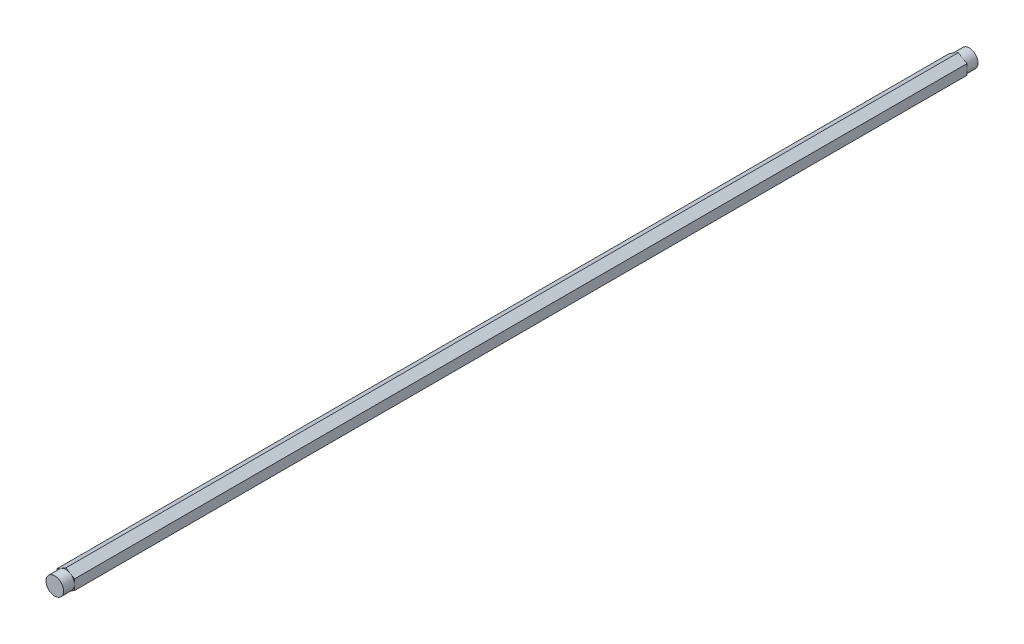
ISO-10303-21;
HEADER;
FILE_DESCRIPTION(('STEP AP214'),'2;1');
FILE_NAME('part.step','',(''),(''),'','','');
FILE_SCHEMA(('AUTOMOTIVE_DESIGN { 1 0 10303 214 1 1 1 1 }'));
ENDSEC;
DATA;
#1=APPLICATION_CONTEXT('core data for automotive mechanical design processes');
#2=APPLICATION_PROTOCOL_DEFINITION('international standard','automotive_design',2000,#1);
#3=PRODUCT_CONTEXT('',#1,'mechanical');
#4=PRODUCT('Part','Part','',(#3));
#5=PRODUCT_RELATED_PRODUCT_CATEGORY('part','',(#4));
#6=PRODUCT_DEFINITION_FORMATION('','',#4);
#7=PRODUCT_DEFINITION_CONTEXT('part definition',#1,'design');
#8=PRODUCT_DEFINITION('design','',#6,#7);
#9=PRODUCT_DEFINITION_SHAPE('','',#8);
#10=(LENGTH_UNIT() NAMED_UNIT(*) SI_UNIT(.MILLI.,.METRE.));
#11=(NAMED_UNIT(*) PLANE_ANGLE_UNIT() SI_UNIT($,.RADIAN.));
#12=(NAMED_UNIT(*) SI_UNIT($,.STERADIAN.) SOLID_ANGLE_UNIT());
#13=UNCERTAINTY_MEASURE_WITH_UNIT(LENGTH_MEASURE(1.E-05),#10,'distance_accuracy_value','');
#14=(GEOMETRIC_REPRESENTATION_CONTEXT(3) GLOBAL_UNCERTAINTY_ASSIGNED_CONTEXT((#13)) GLOBAL_UNIT_ASSIGNED_CONTEXT((#10,
#11,#12)) REPRESENTATION_CONTEXT('',''));
#15=CARTESIAN_POINT('',(0.,0.,0.));
#16=DIRECTION('',(0.,0.,1.));
#17=DIRECTION('',(1.,0.,0.));
#18=AXIS2_PLACEMENT_3D('',#15,#16,#17);
#19=CARTESIAN_POINT('',(6.34999999999996,3.6661742093542,330.2));
#20=DIRECTION('',(-0.499999999999995,-0.866025403784441,0.));
#21=DIRECTION('',(0.866025403784442,-0.499999999999995,0.));
#22=AXIS2_PLACEMENT_3D('',#19,#20,#21);
#23=PLANE('',#22);
#24=DIRECTION('',(0.,0.,-1.));
#25=VECTOR('',#24,1.);
#26=CARTESIAN_POINT('',(0.,7.33234841870825,330.2));
#27=LINE('',#26,#25);
#28=CARTESIAN_POINT('',(0.,7.33234841870825,322.2625));
#29=VERTEX_POINT('',#28);
#30=CARTESIAN_POINT('',(0.,7.33234841870825,-322.2625));
#31=VERTEX_POINT('',#30);
#32=EDGE_CURVE('E210',#29,#31,#27,.T.);
#33=ORIENTED_EDGE('',*,*,#32,.F.);
#34=DIRECTION('',(0.866025403784442,-0.499999999999995,0.));
#35=VECTOR('',#34,1.);
#36=CARTESIAN_POINT('',(6.34999999999996,3.6661742093542,322.2625));
#37=LINE('',#36,#35);
#38=CARTESIAN_POINT('',(3.17499999999997,5.4992613140312,322.2625));
#39=VERTEX_POINT('',#38);
#40=EDGE_CURVE('E263',#29,#39,#37,.T.);
#41=ORIENTED_EDGE('',*,*,#40,.T.);
#42=CARTESIAN_POINT('',(6.34999999999996,3.6661742093542,322.2625));
#43=VERTEX_POINT('',#42);
#44=EDGE_CURVE('E253',#39,#43,#37,.T.);
#45=ORIENTED_EDGE('',*,*,#44,.T.);
#46=DIRECTION('',(0.,0.,-1.));
#47=VECTOR('',#46,1.);
#48=CARTESIAN_POINT('',(6.34999999999996,3.6661742093542,330.2));
#49=LINE('',#48,#47);
#50=CARTESIAN_POINT('',(6.34999999999996,3.6661742093542,-322.2625));
#51=VERTEX_POINT('',#50);
#52=EDGE_CURVE('E201',#43,#51,#49,.T.);
#53=ORIENTED_EDGE('',*,*,#52,.T.);
#54=DIRECTION('',(0.866025403784442,-0.499999999999995,0.));
#55=VECTOR('',#54,1.);
#56=CARTESIAN_POINT('',(6.34999999999996,3.6661742093542,-322.2625));
#57=LINE('',#56,#55);
#58=CARTESIAN_POINT('',(3.17499999999997,5.4992613140312,-322.2625));
#59=VERTEX_POINT('',#58);
#60=EDGE_CURVE('E185',#59,#51,#57,.T.);
#61=ORIENTED_EDGE('',*,*,#60,.F.);
#62=EDGE_CURVE('E189',#31,#59,#57,.T.);
#63=ORIENTED_EDGE('',*,*,#62,.F.);
#64=EDGE_LOOP('',(#33,#41,#45,#53,#61,#63));
#65=FACE_BOUND('',#64,.T.);
#66=ADVANCED_FACE('F48',(#65),#23,.F.);
#67=CARTESIAN_POINT('',(0.,7.33234841870825,330.2));
#68=DIRECTION('',(0.500000000000001,-0.866025403784438,0.));
#69=DIRECTION('',(0.866025403784438,0.500000000000001,0.));
#70=AXIS2_PLACEMENT_3D('',#67,#68,#69);
#71=PLANE('',#70);
#72=DIRECTION('',(0.,0.,-1.));
#73=VECTOR('',#72,1.);
#74=CARTESIAN_POINT('',(-6.35000000000001,3.66617420935411,330.2));
#75=LINE('',#74,#73);
#76=CARTESIAN_POINT('',(-6.35000000000001,3.66617420935411,322.2625));
#77=VERTEX_POINT('',#76);
#78=CARTESIAN_POINT('',(-6.35000000000001,3.66617420935411,-322.2625));
#79=VERTEX_POINT('',#78);
#80=EDGE_CURVE('E208',#77,#79,#75,.T.);
#81=ORIENTED_EDGE('',*,*,#80,.F.);
#82=DIRECTION('',(0.866025403784438,0.500000000000001,0.));
#83=VECTOR('',#82,1.);
#84=CARTESIAN_POINT('',(0.,7.33234841870825,322.2625));
#85=LINE('',#84,#83);
#86=CARTESIAN_POINT('',(-3.17500000000001,5.49926131403118,322.2625));
#87=VERTEX_POINT('',#86);
#88=EDGE_CURVE('E145',#77,#87,#85,.T.);
#89=ORIENTED_EDGE('',*,*,#88,.T.);
#90=EDGE_CURVE('E178',#87,#29,#85,.T.);
#91=ORIENTED_EDGE('',*,*,#90,.T.);
#92=ORIENTED_EDGE('',*,*,#32,.T.);
#93=DIRECTION('',(0.866025403784438,0.500000000000001,0.));
#94=VECTOR('',#93,1.);
#95=CARTESIAN_POINT('',(0.,7.33234841870825,-322.2625));
#96=LINE('',#95,#94);
#97=CARTESIAN_POINT('',(-3.17500000000001,5.49926131403118,-322.2625));
#98=VERTEX_POINT('',#97);
#99=EDGE_CURVE('E192',#98,#31,#96,.T.);
#100=ORIENTED_EDGE('',*,*,#99,.F.);
#101=EDGE_CURVE('E196',#79,#98,#96,.T.);
#102=ORIENTED_EDGE('',*,*,#101,.F.);
#103=EDGE_LOOP('',(#81,#89,#91,#92,#100,#102));
#104=FACE_BOUND('',#103,.T.);
#105=ADVANCED_FACE('F269',(#104),#71,.F.);
#106=CARTESIAN_POINT('',(-6.35000000000001,3.66617420935411,330.2));
#107=DIRECTION('',(1.,0.,0.));
#108=DIRECTION('',(0.,1.,0.));
#109=AXIS2_PLACEMENT_3D('',#106,#107,#108);
#110=PLANE('',#109);
#111=DIRECTION('',(0.,0.,-1.));
#112=VECTOR('',#111,1.);
#113=CARTESIAN_POINT('',(-6.34999999999998,-3.66617420935415,330.2));
#114=LINE('',#113,#112);
#115=CARTESIAN_POINT('',(-6.34999999999998,-3.66617420935415,322.2625));
#116=VERTEX_POINT('',#115);
#117=CARTESIAN_POINT('',(-6.34999999999998,-3.66617420935415,-322.2625));
#118=VERTEX_POINT('',#117);
#119=EDGE_CURVE('E171',#116,#118,#114,.T.);
#120=ORIENTED_EDGE('',*,*,#119,.F.);
#121=DIRECTION('',(0.,1.,0.));
#122=VECTOR('',#121,1.);
#123=CARTESIAN_POINT('',(-6.35000000000001,3.66617420935411,322.2625));
#124=LINE('',#123,#122);
#125=CARTESIAN_POINT('',(-6.35,0.,322.2625));
#126=VERTEX_POINT('',#125);
#127=EDGE_CURVE('E149',#116,#126,#124,.T.);
#128=ORIENTED_EDGE('',*,*,#127,.T.);
#129=EDGE_CURVE('E139',#126,#77,#124,.T.);
#130=ORIENTED_EDGE('',*,*,#129,.T.);
#131=ORIENTED_EDGE('',*,*,#80,.T.);
#132=DIRECTION('',(0.,1.,0.));
#133=VECTOR('',#132,1.);
#134=CARTESIAN_POINT('',(-6.35000000000001,3.66617420935411,-322.2625));
#135=LINE('',#134,#133);
#136=CARTESIAN_POINT('',(-6.35,0.,-322.2625));
#137=VERTEX_POINT('',#136);
#138=EDGE_CURVE('E197',#137,#79,#135,.T.);
#139=ORIENTED_EDGE('',*,*,#138,.F.);
#140=EDGE_CURVE('E200',#118,#137,#135,.T.);
#141=ORIENTED_EDGE('',*,*,#140,.F.);
#142=EDGE_LOOP('',(#120,#128,#130,#131,#139,#141));
#143=FACE_BOUND('',#142,.T.);
#144=ADVANCED_FACE('F169',(#143),#110,.F.);
#145=CARTESIAN_POINT('',(-6.34999999999998,-3.66617420935415,330.2));
#146=DIRECTION('',(0.499999999999995,0.866025403784442,0.));
#147=DIRECTION('',(-0.866025403784442,0.499999999999995,0.));
#148=AXIS2_PLACEMENT_3D('',#145,#146,#147);
#149=PLANE('',#148);
#150=DIRECTION('',(0.,0.,-1.));
#151=VECTOR('',#150,1.);
#152=CARTESIAN_POINT('',(0.,-7.33234841870825,330.2));
#153=LINE('',#152,#151);
#154=CARTESIAN_POINT('',(0.,-7.33234841870825,322.2625));
#155=VERTEX_POINT('',#154);
#156=CARTESIAN_POINT('',(0.,-7.33234841870825,-322.2625));
#157=VERTEX_POINT('',#156);
#158=EDGE_CURVE('E205',#155,#157,#153,.T.);
#159=ORIENTED_EDGE('',*,*,#158,.F.);
#160=DIRECTION('',(-0.866025403784442,0.499999999999995,0.));
#161=VECTOR('',#160,1.);
#162=CARTESIAN_POINT('',(-6.34999999999998,-3.66617420935415,322.2625));
#163=LINE('',#162,#161);
#164=CARTESIAN_POINT('',(-3.17499999999997,-5.4992613140312,322.2625));
#165=VERTEX_POINT('',#164);
#166=EDGE_CURVE('E264',#155,#165,#163,.T.);
#167=ORIENTED_EDGE('',*,*,#166,.T.);
#168=EDGE_CURVE('E150',#165,#116,#163,.T.);
#169=ORIENTED_EDGE('',*,*,#168,.T.);
#170=ORIENTED_EDGE('',*,*,#119,.T.);
#171=DIRECTION('',(-0.866025403784442,0.499999999999995,0.));
#172=VECTOR('',#171,1.);
#173=CARTESIAN_POINT('',(-6.34999999999998,-3.66617420935415,-322.2625));
#174=LINE('',#173,#172);
#175=CARTESIAN_POINT('',(-3.17499999999997,-5.4992613140312,-322.2625));
#176=VERTEX_POINT('',#175);
#177=EDGE_CURVE('E193',#176,#118,#174,.T.);
#178=ORIENTED_EDGE('',*,*,#177,.F.);
#179=EDGE_CURVE('E190',#157,#176,#174,.T.);
#180=ORIENTED_EDGE('',*,*,#179,.F.);
#181=EDGE_LOOP('',(#159,#167,#169,#170,#178,#180));
#182=FACE_BOUND('',#181,.T.);
#183=ADVANCED_FACE('F282',(#182),#149,.F.);
#184=CARTESIAN_POINT('',(0.,-7.33234841870825,330.2));
#185=DIRECTION('',(-0.500000000000007,0.866025403784435,0.));
#186=DIRECTION('',(-0.866025403784435,-0.500000000000007,0.));
#187=AXIS2_PLACEMENT_3D('',#184,#185,#186);
#188=PLANE('',#187);
#189=DIRECTION('',(0.,0.,-1.));
#190=VECTOR('',#189,1.);
#191=CARTESIAN_POINT('',(6.35000000000003,-3.66617420935406,330.2));
#192=LINE('',#191,#190);
#193=CARTESIAN_POINT('',(6.35000000000003,-3.66617420935406,322.2625));
#194=VERTEX_POINT('',#193);
#195=CARTESIAN_POINT('',(6.35000000000003,-3.66617420935406,-322.2625));
#196=VERTEX_POINT('',#195);
#197=EDGE_CURVE('E203',#194,#196,#192,.T.);
#198=ORIENTED_EDGE('',*,*,#197,.F.);
#199=DIRECTION('',(-0.866025403784435,-0.500000000000007,0.));
#200=VECTOR('',#199,1.);
#201=CARTESIAN_POINT('',(0.,-7.33234841870825,322.2625));
#202=LINE('',#201,#200);
#203=CARTESIAN_POINT('',(3.17500000000004,-5.49926131403116,322.2625));
#204=VERTEX_POINT('',#203);
#205=EDGE_CURVE('E62',#194,#204,#202,.T.);
#206=ORIENTED_EDGE('',*,*,#205,.T.);
#207=EDGE_CURVE('E262',#204,#155,#202,.T.);
#208=ORIENTED_EDGE('',*,*,#207,.T.);
#209=ORIENTED_EDGE('',*,*,#158,.T.);
#210=DIRECTION('',(-0.866025403784435,-0.500000000000007,0.));
#211=VECTOR('',#210,1.);
#212=CARTESIAN_POINT('',(0.,-7.33234841870825,-322.2625));
#213=LINE('',#212,#211);
#214=CARTESIAN_POINT('',(3.17500000000004,-5.49926131403116,-322.2625));
#215=VERTEX_POINT('',#214);
#216=EDGE_CURVE('E186',#215,#157,#213,.T.);
#217=ORIENTED_EDGE('',*,*,#216,.F.);
#218=EDGE_CURVE('E182',#196,#215,#213,.T.);
#219=ORIENTED_EDGE('',*,*,#218,.F.);
#220=EDGE_LOOP('',(#198,#206,#208,#209,#217,#219));
#221=FACE_BOUND('',#220,.T.);
#222=ADVANCED_FACE('F238',(#221),#188,.F.);
#223=CARTESIAN_POINT('',(6.35000000000003,-3.66617420935406,330.2));
#224=DIRECTION('',(-1.,0.,0.));
#225=DIRECTION('',(0.,-1.,0.));
#226=AXIS2_PLACEMENT_3D('',#223,#224,#225);
#227=PLANE('',#226);
#228=ORIENTED_EDGE('',*,*,#52,.F.);
#229=DIRECTION('',(0.,-1.,0.));
#230=VECTOR('',#229,1.);
#231=CARTESIAN_POINT('',(6.35000000000003,-3.66617420935406,322.2625));
#232=LINE('',#231,#230);
#233=CARTESIAN_POINT('',(6.35,0.,322.2625));
#234=VERTEX_POINT('',#233);
#235=EDGE_CURVE('E12',#43,#234,#232,.T.);
#236=ORIENTED_EDGE('',*,*,#235,.T.);
#237=EDGE_CURVE('E51',#234,#194,#232,.T.);
#238=ORIENTED_EDGE('',*,*,#237,.T.);
#239=ORIENTED_EDGE('',*,*,#197,.T.);
#240=DIRECTION('',(0.,-1.,0.));
#241=VECTOR('',#240,1.);
#242=CARTESIAN_POINT('',(6.35000000000003,-3.66617420935406,-322.2625));
#243=LINE('',#242,#241);
#244=CARTESIAN_POINT('',(6.35,0.,-322.2625));
#245=VERTEX_POINT('',#244);
#246=EDGE_CURVE('E215',#245,#196,#243,.T.);
#247=ORIENTED_EDGE('',*,*,#246,.F.);
#248=EDGE_CURVE('E217',#51,#245,#243,.T.);
#249=ORIENTED_EDGE('',*,*,#248,.F.);
#250=EDGE_LOOP('',(#228,#236,#238,#239,#247,#249));
#251=FACE_BOUND('',#250,.T.);
#252=ADVANCED_FACE('F229',(#251),#227,.F.);
#253=CARTESIAN_POINT('',(0.,0.,-322.2625));
#254=DIRECTION('',(0.,0.,-1.));
#255=DIRECTION('',(-1.,0.,0.));
#256=AXIS2_PLACEMENT_3D('',#253,#254,#255);
#257=PLANE('',#256);
#258=ORIENTED_EDGE('',*,*,#140,.T.);
#259=CARTESIAN_POINT('',(0.,0.,-322.2625));
#260=DIRECTION('',(0.,0.,-1.));
#261=DIRECTION('',(-1.,0.,0.));
#262=AXIS2_PLACEMENT_3D('',#259,#260,#261);
#263=CIRCLE('',#262,6.35);
#264=EDGE_CURVE('E172',#176,#137,#263,.T.);
#265=ORIENTED_EDGE('',*,*,#264,.F.);
#266=ORIENTED_EDGE('',*,*,#177,.T.);
#267=EDGE_LOOP('',(#258,#265,#266));
#268=FACE_BOUND('',#267,.T.);
#269=ADVANCED_FACE('F281',(#268),#257,.T.);
#270=ORIENTED_EDGE('',*,*,#138,.T.);
#271=ORIENTED_EDGE('',*,*,#101,.T.);
#272=EDGE_CURVE('E176',#137,#98,#263,.T.);
#273=ORIENTED_EDGE('',*,*,#272,.F.);
#274=EDGE_LOOP('',(#270,#271,#273));
#275=FACE_BOUND('',#274,.T.);
#276=ADVANCED_FACE('F274',(#275),#257,.T.);
#277=ORIENTED_EDGE('',*,*,#99,.T.);
#278=ORIENTED_EDGE('',*,*,#62,.T.);
#279=EDGE_CURVE('E183',#98,#59,#263,.T.);
#280=ORIENTED_EDGE('',*,*,#279,.F.);
#281=EDGE_LOOP('',(#277,#278,#280));
#282=FACE_BOUND('',#281,.T.);
#283=ADVANCED_FACE('F247',(#282),#257,.T.);
#284=ORIENTED_EDGE('',*,*,#179,.T.);
#285=EDGE_CURVE('E174',#215,#176,#263,.T.);
#286=ORIENTED_EDGE('',*,*,#285,.F.);
#287=ORIENTED_EDGE('',*,*,#216,.T.);
#288=EDGE_LOOP('',(#284,#286,#287));
#289=FACE_BOUND('',#288,.T.);
#290=ADVANCED_FACE('F283',(#289),#257,.T.);
#291=ORIENTED_EDGE('',*,*,#60,.T.);
#292=ORIENTED_EDGE('',*,*,#248,.T.);
#293=EDGE_CURVE('E70',#59,#245,#263,.T.);
#294=ORIENTED_EDGE('',*,*,#293,.F.);
#295=EDGE_LOOP('',(#291,#292,#294));
#296=FACE_BOUND('',#295,.T.);
#297=ADVANCED_FACE('F225',(#296),#257,.T.);
#298=ORIENTED_EDGE('',*,*,#218,.T.);
#299=EDGE_CURVE('E235',#245,#215,#263,.T.);
#300=ORIENTED_EDGE('',*,*,#299,.F.);
#301=ORIENTED_EDGE('',*,*,#246,.T.);
#302=EDGE_LOOP('',(#298,#300,#301));
#303=FACE_BOUND('',#302,.T.);
#304=ADVANCED_FACE('F233',(#303),#257,.T.);
#305=CARTESIAN_POINT('',(0.,0.,-322.2625));
#306=DIRECTION('',(0.,0.,-1.));
#307=DIRECTION('',(-1.,0.,0.));
#308=AXIS2_PLACEMENT_3D('',#305,#306,#307);
#309=CYLINDRICAL_SURFACE('',#308,6.35);
#310=CARTESIAN_POINT('',(0.,0.,-330.2));
#311=DIRECTION('',(0.,0.,1.));
#312=DIRECTION('',(1.,0.,0.));
#313=AXIS2_PLACEMENT_3D('',#310,#311,#312);
#314=CIRCLE('',#313,6.35);
#315=CARTESIAN_POINT('',(6.35,0.,-330.2));
#316=VERTEX_POINT('',#315);
#317=EDGE_CURVE('E212',#316,#316,#314,.T.);
#318=ORIENTED_EDGE('',*,*,#317,.T.);
#319=EDGE_LOOP('',(#318));
#320=FACE_BOUND('',#319,.T.);
#321=ORIENTED_EDGE('',*,*,#279,.T.);
#322=ORIENTED_EDGE('',*,*,#293,.T.);
#323=ORIENTED_EDGE('',*,*,#299,.T.);
#324=ORIENTED_EDGE('',*,*,#285,.T.);
#325=ORIENTED_EDGE('',*,*,#264,.T.);
#326=ORIENTED_EDGE('',*,*,#272,.T.);
#327=EDGE_LOOP('',(#321,#322,#323,#324,#325,#326));
#328=FACE_BOUND('',#327,.T.);
#329=ADVANCED_FACE('F275',(#320,#328),#309,.T.);
#330=CARTESIAN_POINT('',(0.,0.,-330.2));
#331=DIRECTION('',(0.,0.,1.));
#332=DIRECTION('',(1.,0.,0.));
#333=AXIS2_PLACEMENT_3D('',#330,#331,#332);
#334=PLANE('',#333);
#335=ORIENTED_EDGE('',*,*,#317,.F.);
#336=EDGE_LOOP('',(#335));
#337=FACE_BOUND('',#336,.T.);
#338=ADVANCED_FACE('F307',(#337),#334,.F.);
#339=CARTESIAN_POINT('',(0.,0.,322.2625));
#340=DIRECTION('',(0.,0.,-1.));
#341=DIRECTION('',(-1.,0.,0.));
#342=AXIS2_PLACEMENT_3D('',#339,#340,#341);
#343=PLANE('',#342);
#344=ORIENTED_EDGE('',*,*,#168,.F.);
#345=CARTESIAN_POINT('',(0.,0.,322.2625));
#346=DIRECTION('',(0.,0.,-1.));
#347=DIRECTION('',(-1.,0.,0.));
#348=AXIS2_PLACEMENT_3D('',#345,#346,#347);
#349=CIRCLE('',#348,6.35);
#350=EDGE_CURVE('E154',#165,#126,#349,.T.);
#351=ORIENTED_EDGE('',*,*,#350,.T.);
#352=ORIENTED_EDGE('',*,*,#127,.F.);
#353=EDGE_LOOP('',(#344,#351,#352));
#354=FACE_BOUND('',#353,.T.);
#355=ADVANCED_FACE('F155',(#354),#343,.F.);
#356=EDGE_CURVE('E143',#126,#87,#349,.T.);
#357=ORIENTED_EDGE('',*,*,#356,.T.);
#358=ORIENTED_EDGE('',*,*,#88,.F.);
#359=ORIENTED_EDGE('',*,*,#129,.F.);
#360=EDGE_LOOP('',(#357,#358,#359));
#361=FACE_BOUND('',#360,.T.);
#362=ADVANCED_FACE('F141',(#361),#343,.F.);
#363=EDGE_CURVE('E167',#87,#39,#349,.T.);
#364=ORIENTED_EDGE('',*,*,#363,.T.);
#365=ORIENTED_EDGE('',*,*,#40,.F.);
#366=ORIENTED_EDGE('',*,*,#90,.F.);
#367=EDGE_LOOP('',(#364,#365,#366));
#368=FACE_BOUND('',#367,.T.);
#369=ADVANCED_FACE('F427',(#368),#343,.F.);
#370=ORIENTED_EDGE('',*,*,#207,.F.);
#371=EDGE_CURVE('E160',#204,#165,#349,.T.);
#372=ORIENTED_EDGE('',*,*,#371,.T.);
#373=ORIENTED_EDGE('',*,*,#166,.F.);
#374=EDGE_LOOP('',(#370,#372,#373));
#375=FACE_BOUND('',#374,.T.);
#376=ADVANCED_FACE('F436',(#375),#343,.F.);
#377=EDGE_CURVE('E257',#39,#234,#349,.T.);
#378=ORIENTED_EDGE('',*,*,#377,.T.);
#379=ORIENTED_EDGE('',*,*,#235,.F.);
#380=ORIENTED_EDGE('',*,*,#44,.F.);
#381=EDGE_LOOP('',(#378,#379,#380));
#382=FACE_BOUND('',#381,.T.);
#383=ADVANCED_FACE('F256',(#382),#343,.F.);
#384=ORIENTED_EDGE('',*,*,#237,.F.);
#385=EDGE_CURVE('E259',#234,#204,#349,.T.);
#386=ORIENTED_EDGE('',*,*,#385,.T.);
#387=ORIENTED_EDGE('',*,*,#205,.F.);
#388=EDGE_LOOP('',(#384,#386,#387));
#389=FACE_BOUND('',#388,.T.);
#390=ADVANCED_FACE('F316',(#389),#343,.F.);
#391=CARTESIAN_POINT('',(0.,0.,322.2625));
#392=DIRECTION('',(0.,0.,1.));
#393=DIRECTION('',(1.,0.,0.));
#394=AXIS2_PLACEMENT_3D('',#391,#392,#393);
#395=CYLINDRICAL_SURFACE('',#394,6.35);
#396=ORIENTED_EDGE('',*,*,#377,.F.);
#397=ORIENTED_EDGE('',*,*,#363,.F.);
#398=ORIENTED_EDGE('',*,*,#356,.F.);
#399=ORIENTED_EDGE('',*,*,#350,.F.);
#400=ORIENTED_EDGE('',*,*,#371,.F.);
#401=ORIENTED_EDGE('',*,*,#385,.F.);
#402=EDGE_LOOP('',(#396,#397,#398,#399,#400,#401));
#403=FACE_BOUND('',#402,.T.);
#404=CARTESIAN_POINT('',(0.,0.,330.2));
#405=DIRECTION('',(0.,0.,1.));
#406=DIRECTION('',(1.,0.,0.));
#407=AXIS2_PLACEMENT_3D('',#404,#405,#406);
#408=CIRCLE('',#407,6.35);
#409=CARTESIAN_POINT('',(6.35,0.,330.2));
#410=VERTEX_POINT('',#409);
#411=EDGE_CURVE('E218',#410,#410,#408,.F.);
#412=ORIENTED_EDGE('',*,*,#411,.T.);
#413=EDGE_LOOP('',(#412));
#414=FACE_BOUND('',#413,.T.);
#415=ADVANCED_FACE('F164',(#403,#414),#395,.T.);
#416=CARTESIAN_POINT('',(0.,0.,330.2));
#417=DIRECTION('',(0.,0.,1.));
#418=DIRECTION('',(1.,0.,0.));
#419=AXIS2_PLACEMENT_3D('',#416,#417,#418);
#420=PLANE('',#419);
#421=ORIENTED_EDGE('',*,*,#411,.F.);
#422=EDGE_LOOP('',(#421));
#423=FACE_BOUND('',#422,.T.);
#424=ADVANCED_FACE('F310',(#423),#420,.T.);
#425=CLOSED_SHELL('',(#66,#105,#144,#183,#222,#252,#269,#276,#283,#290,#297,#304,#329,#338,#355,
#362,#369,#376,#383,#390,#415,#424));
#426=MANIFOLD_SOLID_BREP('B2',#425);
#427=ADVANCED_BREP_SHAPE_REPRESENTATION('',(#18,#426),#14);
#428=SHAPE_DEFINITION_REPRESENTATION(#9,#427);
ENDSEC;
END-ISO-10303-21;
